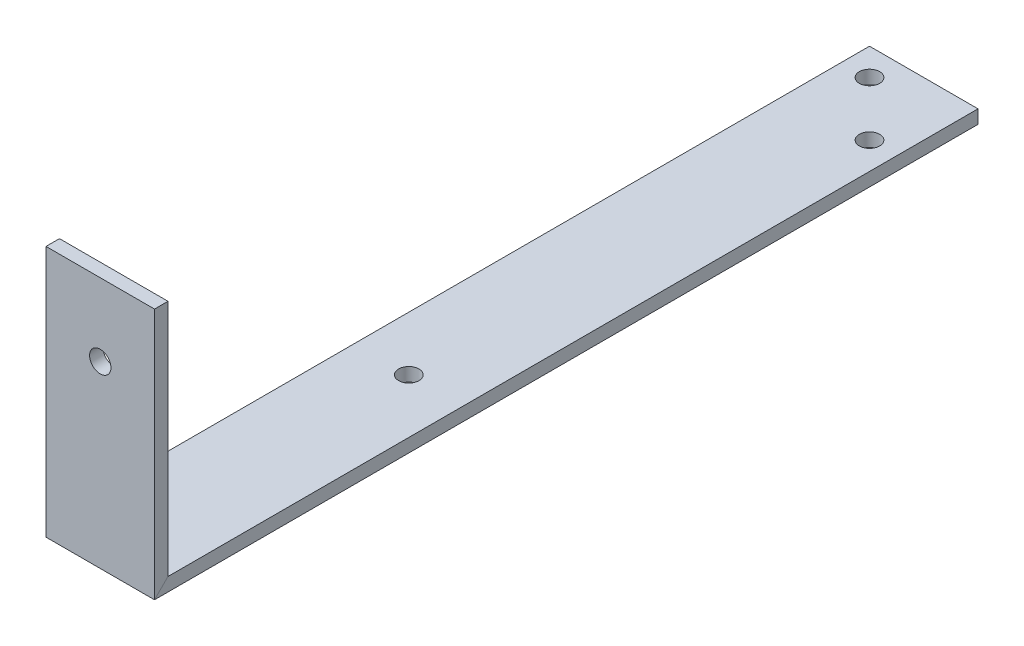
ISO-10303-21;
HEADER;
FILE_DESCRIPTION(('STEP AP214'),'2;1');
FILE_NAME('part.step','',(''),(''),'','','');
FILE_SCHEMA(('AUTOMOTIVE_DESIGN { 1 0 10303 214 1 1 1 1 }'));
ENDSEC;
DATA;
#1=APPLICATION_CONTEXT('core data for automotive mechanical design processes');
#2=APPLICATION_PROTOCOL_DEFINITION('international standard','automotive_design',2000,#1);
#3=PRODUCT_CONTEXT('',#1,'mechanical');
#4=PRODUCT('Part','Part','',(#3));
#5=PRODUCT_RELATED_PRODUCT_CATEGORY('part','',(#4));
#6=PRODUCT_DEFINITION_FORMATION('','',#4);
#7=PRODUCT_DEFINITION_CONTEXT('part definition',#1,'design');
#8=PRODUCT_DEFINITION('design','',#6,#7);
#9=PRODUCT_DEFINITION_SHAPE('','',#8);
#10=(LENGTH_UNIT() NAMED_UNIT(*) SI_UNIT(.MILLI.,.METRE.));
#11=(NAMED_UNIT(*) PLANE_ANGLE_UNIT() SI_UNIT($,.RADIAN.));
#12=(NAMED_UNIT(*) SI_UNIT($,.STERADIAN.) SOLID_ANGLE_UNIT());
#13=UNCERTAINTY_MEASURE_WITH_UNIT(LENGTH_MEASURE(1.E-05),#10,'distance_accuracy_value','');
#14=(GEOMETRIC_REPRESENTATION_CONTEXT(3) GLOBAL_UNCERTAINTY_ASSIGNED_CONTEXT((#13)) GLOBAL_UNIT_ASSIGNED_CONTEXT((#10,
#11,#12)) REPRESENTATION_CONTEXT('',''));
#15=CARTESIAN_POINT('',(0.,0.,0.));
#16=DIRECTION('',(0.,0.,1.));
#17=DIRECTION('',(1.,0.,0.));
#18=AXIS2_PLACEMENT_3D('',#15,#16,#17);
#19=CARTESIAN_POINT('',(1761.3,-570.395,308.16));
#20=DIRECTION('',(0.,1.,0.));
#21=DIRECTION('',(0.,0.,1.));
#22=AXIS2_PLACEMENT_3D('',#19,#20,#21);
#23=PLANE('',#22);
#24=CARTESIAN_POINT('',(1773.99999999906,-570.395,323.462204665884));
#25=DIRECTION('',(0.,-1.,0.));
#26=DIRECTION('',(0.,0.,-1.));
#27=AXIS2_PLACEMENT_3D('',#24,#25,#26);
#28=CIRCLE('',#27,4.76250000000013);
#29=CARTESIAN_POINT('',(1773.99999999906,-570.395,318.699704665884));
#30=VERTEX_POINT('',#29);
#31=EDGE_CURVE('E145',#30,#30,#28,.T.);
#32=ORIENTED_EDGE('',*,*,#31,.F.);
#33=EDGE_LOOP('',(#32));
#34=FACE_BOUND('',#33,.T.);
#35=CARTESIAN_POINT('',(1799.39999999906,-570.395,348.862204665884));
#36=DIRECTION('',(0.,-1.,0.));
#37=DIRECTION('',(0.,0.,-1.));
#38=AXIS2_PLACEMENT_3D('',#35,#36,#37);
#39=CIRCLE('',#38,4.76250000000011);
#40=CARTESIAN_POINT('',(1799.39999999906,-570.395,344.099704665884));
#41=VERTEX_POINT('',#40);
#42=EDGE_CURVE('E134',#41,#41,#39,.T.);
#43=ORIENTED_EDGE('',*,*,#42,.F.);
#44=EDGE_LOOP('',(#43));
#45=FACE_BOUND('',#44,.T.);
#46=CARTESIAN_POINT('',(1786.7,-570.395,551.855));
#47=DIRECTION('',(0.,1.,0.));
#48=DIRECTION('',(0.,0.,1.));
#49=AXIS2_PLACEMENT_3D('',#46,#47,#48);
#50=CIRCLE('',#49,4.76249999999992);
#51=CARTESIAN_POINT('',(1786.7,-570.395,556.6175));
#52=VERTEX_POINT('',#51);
#53=EDGE_CURVE('E95',#52,#52,#50,.T.);
#54=ORIENTED_EDGE('',*,*,#53,.T.);
#55=EDGE_LOOP('',(#54));
#56=FACE_BOUND('',#55,.T.);
#57=DIRECTION('',(-1.,0.,0.));
#58=VECTOR('',#57,1.);
#59=CARTESIAN_POINT('',(1812.1,-570.395,310.76));
#60=LINE('',#59,#58);
#61=CARTESIAN_POINT('',(1812.1,-570.395,310.76));
#62=VERTEX_POINT('',#61);
#63=CARTESIAN_POINT('',(1761.3,-570.395,310.76));
#64=VERTEX_POINT('',#63);
#65=EDGE_CURVE('E51',#62,#64,#60,.T.);
#66=ORIENTED_EDGE('',*,*,#65,.F.);
#67=DIRECTION('',(0.,0.,1.));
#68=VECTOR('',#67,1.);
#69=CARTESIAN_POINT('',(1812.1,-570.395,308.16));
#70=LINE('',#69,#68);
#71=CARTESIAN_POINT('',(1812.1,-570.395,696.315));
#72=VERTEX_POINT('',#71);
#73=EDGE_CURVE('E103',#62,#72,#70,.T.);
#74=ORIENTED_EDGE('',*,*,#73,.T.);
#75=DIRECTION('',(1.,0.,0.));
#76=VECTOR('',#75,1.);
#77=CARTESIAN_POINT('',(1761.3,-570.395,696.315));
#78=LINE('',#77,#76);
#79=CARTESIAN_POINT('',(1761.3,-570.395,696.315));
#80=VERTEX_POINT('',#79);
#81=EDGE_CURVE('E119',#80,#72,#78,.T.);
#82=ORIENTED_EDGE('',*,*,#81,.F.);
#83=DIRECTION('',(0.,0.,1.));
#84=VECTOR('',#83,1.);
#85=CARTESIAN_POINT('',(1761.3,-570.395,308.16));
#86=LINE('',#85,#84);
#87=EDGE_CURVE('E109',#64,#80,#86,.T.);
#88=ORIENTED_EDGE('',*,*,#87,.F.);
#89=EDGE_LOOP('',(#66,#74,#82,#88));
#90=FACE_BOUND('',#89,.T.);
#91=ADVANCED_FACE('F34',(#34,#45,#56,#90),#23,.F.);
#92=CARTESIAN_POINT('',(1812.1,-570.395,308.16));
#93=DIRECTION('',(-1.,0.,0.));
#94=DIRECTION('',(0.,0.,1.));
#95=AXIS2_PLACEMENT_3D('',#92,#93,#94);
#96=PLANE('',#95);
#97=DIRECTION('',(0.,-1.,0.));
#98=VECTOR('',#97,1.);
#99=CARTESIAN_POINT('',(1812.1,-564.085,310.76));
#100=LINE('',#99,#98);
#101=CARTESIAN_POINT('',(1812.1,-564.085,310.76));
#102=VERTEX_POINT('',#101);
#103=EDGE_CURVE('E90',#102,#62,#100,.T.);
#104=ORIENTED_EDGE('',*,*,#103,.F.);
#105=DIRECTION('',(0.,0.,1.));
#106=VECTOR('',#105,1.);
#107=CARTESIAN_POINT('',(1812.1,-564.085,308.16));
#108=LINE('',#107,#106);
#109=CARTESIAN_POINT('',(1812.1,-564.085,690.005));
#110=VERTEX_POINT('',#109);
#111=EDGE_CURVE('E101',#102,#110,#108,.T.);
#112=ORIENTED_EDGE('',*,*,#111,.T.);
#113=DIRECTION('',(0.,0.707106781186548,-0.707106781186548));
#114=VECTOR('',#113,1.);
#115=CARTESIAN_POINT('',(1812.1,-376.3175,502.2375));
#116=LINE('',#115,#114);
#117=EDGE_CURVE('E43',#72,#110,#116,.T.);
#118=ORIENTED_EDGE('',*,*,#117,.F.);
#119=ORIENTED_EDGE('',*,*,#73,.F.);
#120=EDGE_LOOP('',(#104,#112,#118,#119));
#121=FACE_BOUND('',#120,.T.);
#122=ADVANCED_FACE('F99',(#121),#96,.F.);
#123=CARTESIAN_POINT('',(1761.3,-564.085,308.16));
#124=DIRECTION('',(0.,-1.,0.));
#125=DIRECTION('',(0.,0.,-1.));
#126=AXIS2_PLACEMENT_3D('',#123,#124,#125);
#127=PLANE('',#126);
#128=CARTESIAN_POINT('',(1773.99999999906,-564.085,323.462204665884));
#129=DIRECTION('',(0.,-1.,0.));
#130=DIRECTION('',(0.,0.,-1.));
#131=AXIS2_PLACEMENT_3D('',#128,#129,#130);
#132=CIRCLE('',#131,4.76250000000013);
#133=CARTESIAN_POINT('',(1773.99999999906,-564.085,318.699704665884));
#134=VERTEX_POINT('',#133);
#135=EDGE_CURVE('E38',#134,#134,#132,.T.);
#136=ORIENTED_EDGE('',*,*,#135,.T.);
#137=EDGE_LOOP('',(#136));
#138=FACE_BOUND('',#137,.T.);
#139=CARTESIAN_POINT('',(1799.39999999906,-564.085,348.862204665884));
#140=DIRECTION('',(0.,-1.,0.));
#141=DIRECTION('',(0.,0.,-1.));
#142=AXIS2_PLACEMENT_3D('',#139,#140,#141);
#143=CIRCLE('',#142,4.76250000000011);
#144=CARTESIAN_POINT('',(1799.39999999906,-564.085,344.099704665884));
#145=VERTEX_POINT('',#144);
#146=EDGE_CURVE('E131',#145,#145,#143,.T.);
#147=ORIENTED_EDGE('',*,*,#146,.T.);
#148=EDGE_LOOP('',(#147));
#149=FACE_BOUND('',#148,.T.);
#150=CARTESIAN_POINT('',(1786.7,-564.085,551.855));
#151=DIRECTION('',(0.,1.,0.));
#152=DIRECTION('',(0.,0.,1.));
#153=AXIS2_PLACEMENT_3D('',#150,#151,#152);
#154=CIRCLE('',#153,4.76249999999992);
#155=CARTESIAN_POINT('',(1786.7,-564.085,556.6175));
#156=VERTEX_POINT('',#155);
#157=EDGE_CURVE('E150',#156,#156,#154,.T.);
#158=ORIENTED_EDGE('',*,*,#157,.F.);
#159=EDGE_LOOP('',(#158));
#160=FACE_BOUND('',#159,.T.);
#161=DIRECTION('',(1.,0.,0.));
#162=VECTOR('',#161,1.);
#163=CARTESIAN_POINT('',(1761.3,-564.085,310.76));
#164=LINE('',#163,#162);
#165=CARTESIAN_POINT('',(1761.3,-564.085,310.76));
#166=VERTEX_POINT('',#165);
#167=EDGE_CURVE('E87',#166,#102,#164,.T.);
#168=ORIENTED_EDGE('',*,*,#167,.F.);
#169=DIRECTION('',(0.,0.,1.));
#170=VECTOR('',#169,1.);
#171=CARTESIAN_POINT('',(1761.3,-564.085,308.16));
#172=LINE('',#171,#170);
#173=CARTESIAN_POINT('',(1761.3,-564.085,690.005));
#174=VERTEX_POINT('',#173);
#175=EDGE_CURVE('E107',#166,#174,#172,.T.);
#176=ORIENTED_EDGE('',*,*,#175,.T.);
#177=DIRECTION('',(-1.,0.,0.));
#178=VECTOR('',#177,1.);
#179=CARTESIAN_POINT('',(1761.3,-564.085,690.005));
#180=LINE('',#179,#178);
#181=EDGE_CURVE('E11',#110,#174,#180,.T.);
#182=ORIENTED_EDGE('',*,*,#181,.F.);
#183=ORIENTED_EDGE('',*,*,#111,.F.);
#184=EDGE_LOOP('',(#168,#176,#182,#183));
#185=FACE_BOUND('',#184,.T.);
#186=ADVANCED_FACE('F105',(#138,#149,#160,#185),#127,.F.);
#187=CARTESIAN_POINT('',(1761.3,-570.395,308.16));
#188=DIRECTION('',(1.,0.,0.));
#189=DIRECTION('',(0.,0.,-1.));
#190=AXIS2_PLACEMENT_3D('',#187,#188,#189);
#191=PLANE('',#190);
#192=DIRECTION('',(0.,1.,0.));
#193=VECTOR('',#192,1.);
#194=CARTESIAN_POINT('',(1761.3,-570.395,310.76));
#195=LINE('',#194,#193);
#196=EDGE_CURVE('E91',#64,#166,#195,.T.);
#197=ORIENTED_EDGE('',*,*,#196,.F.);
#198=ORIENTED_EDGE('',*,*,#87,.T.);
#199=DIRECTION('',(0.,-0.707106781186548,0.707106781186548));
#200=VECTOR('',#199,1.);
#201=CARTESIAN_POINT('',(1761.3,-376.3175,502.2375));
#202=LINE('',#201,#200);
#203=EDGE_CURVE('E116',#174,#80,#202,.T.);
#204=ORIENTED_EDGE('',*,*,#203,.F.);
#205=ORIENTED_EDGE('',*,*,#175,.F.);
#206=EDGE_LOOP('',(#197,#198,#204,#205));
#207=FACE_BOUND('',#206,.T.);
#208=ADVANCED_FACE('F183',(#207),#191,.F.);
#209=CARTESIAN_POINT('',(1761.3,-570.8105,696.315));
#210=DIRECTION('',(0.,0.,-1.));
#211=DIRECTION('',(-1.,0.,0.));
#212=AXIS2_PLACEMENT_3D('',#209,#210,#211);
#213=PLANE('',#212);
#214=CARTESIAN_POINT('',(1786.70000007806,-486.498712740003,696.315));
#215=DIRECTION('',(0.,0.,-1.));
#216=DIRECTION('',(-1.,0.,0.));
#217=AXIS2_PLACEMENT_3D('',#214,#215,#216);
#218=CIRCLE('',#217,5.00000002243565);
#219=CARTESIAN_POINT('',(1781.70000005563,-486.498712740003,696.315));
#220=VERTEX_POINT('',#219);
#221=EDGE_CURVE('E138',#220,#220,#218,.T.);
#222=ORIENTED_EDGE('',*,*,#221,.T.);
#223=EDGE_LOOP('',(#222));
#224=FACE_BOUND('',#223,.T.);
#225=DIRECTION('',(0.,1.,0.));
#226=VECTOR('',#225,1.);
#227=CARTESIAN_POINT('',(1812.1,-570.8105,696.315));
#228=LINE('',#227,#226);
#229=CARTESIAN_POINT('',(1812.1,-452.495,696.315));
#230=VERTEX_POINT('',#229);
#231=EDGE_CURVE('E120',#72,#230,#228,.T.);
#232=ORIENTED_EDGE('',*,*,#231,.T.);
#233=DIRECTION('',(1.,0.,0.));
#234=VECTOR('',#233,1.);
#235=CARTESIAN_POINT('',(2022.1,-452.495,696.315));
#236=LINE('',#235,#234);
#237=CARTESIAN_POINT('',(1761.3,-452.495,696.315));
#238=VERTEX_POINT('',#237);
#239=EDGE_CURVE('E157',#238,#230,#236,.T.);
#240=ORIENTED_EDGE('',*,*,#239,.F.);
#241=DIRECTION('',(0.,1.,0.));
#242=VECTOR('',#241,1.);
#243=CARTESIAN_POINT('',(1761.3,-570.8105,696.315));
#244=LINE('',#243,#242);
#245=EDGE_CURVE('E111',#80,#238,#244,.T.);
#246=ORIENTED_EDGE('',*,*,#245,.F.);
#247=ORIENTED_EDGE('',*,*,#81,.T.);
#248=EDGE_LOOP('',(#232,#240,#246,#247));
#249=FACE_BOUND('',#248,.T.);
#250=ADVANCED_FACE('F36',(#224,#249),#213,.F.);
#251=CARTESIAN_POINT('',(1812.1,-570.8105,696.315));
#252=DIRECTION('',(-1.,0.,0.));
#253=DIRECTION('',(0.,0.,1.));
#254=AXIS2_PLACEMENT_3D('',#251,#252,#253);
#255=PLANE('',#254);
#256=DIRECTION('',(0.,1.,0.));
#257=VECTOR('',#256,1.);
#258=CARTESIAN_POINT('',(1812.1,-570.8105,690.005));
#259=LINE('',#258,#257);
#260=CARTESIAN_POINT('',(1812.1,-452.495,690.005));
#261=VERTEX_POINT('',#260);
#262=EDGE_CURVE('E123',#110,#261,#259,.T.);
#263=ORIENTED_EDGE('',*,*,#262,.T.);
#264=DIRECTION('',(0.,0.,1.));
#265=VECTOR('',#264,1.);
#266=CARTESIAN_POINT('',(1812.1,-452.495,696.315));
#267=LINE('',#266,#265);
#268=EDGE_CURVE('E124',#261,#230,#267,.T.);
#269=ORIENTED_EDGE('',*,*,#268,.T.);
#270=ORIENTED_EDGE('',*,*,#231,.F.);
#271=ORIENTED_EDGE('',*,*,#117,.T.);
#272=EDGE_LOOP('',(#263,#269,#270,#271));
#273=FACE_BOUND('',#272,.T.);
#274=ADVANCED_FACE('F174',(#273),#255,.F.);
#275=CARTESIAN_POINT('',(1761.3,-570.8105,690.005));
#276=DIRECTION('',(0.,0.,1.));
#277=DIRECTION('',(1.,0.,0.));
#278=AXIS2_PLACEMENT_3D('',#275,#276,#277);
#279=PLANE('',#278);
#280=CARTESIAN_POINT('',(1786.70000007806,-486.498712740003,690.005));
#281=DIRECTION('',(0.,0.,-1.));
#282=DIRECTION('',(-1.,0.,0.));
#283=AXIS2_PLACEMENT_3D('',#280,#281,#282);
#284=CIRCLE('',#283,5.00000002243565);
#285=CARTESIAN_POINT('',(1781.70000005563,-486.498712740003,690.005));
#286=VERTEX_POINT('',#285);
#287=EDGE_CURVE('E133',#286,#286,#284,.T.);
#288=ORIENTED_EDGE('',*,*,#287,.F.);
#289=EDGE_LOOP('',(#288));
#290=FACE_BOUND('',#289,.T.);
#291=DIRECTION('',(0.,1.,0.));
#292=VECTOR('',#291,1.);
#293=CARTESIAN_POINT('',(1761.3,-570.8105,690.005));
#294=LINE('',#293,#292);
#295=CARTESIAN_POINT('',(1761.3,-452.495,690.005));
#296=VERTEX_POINT('',#295);
#297=EDGE_CURVE('E127',#174,#296,#294,.T.);
#298=ORIENTED_EDGE('',*,*,#297,.T.);
#299=DIRECTION('',(-1.,0.,0.));
#300=VECTOR('',#299,1.);
#301=CARTESIAN_POINT('',(1761.3,-452.495,690.005));
#302=LINE('',#301,#300);
#303=EDGE_CURVE('E59',#261,#296,#302,.T.);
#304=ORIENTED_EDGE('',*,*,#303,.F.);
#305=ORIENTED_EDGE('',*,*,#262,.F.);
#306=ORIENTED_EDGE('',*,*,#181,.T.);
#307=EDGE_LOOP('',(#298,#304,#305,#306));
#308=FACE_BOUND('',#307,.T.);
#309=ADVANCED_FACE('F177',(#290,#308),#279,.F.);
#310=CARTESIAN_POINT('',(1761.3,-570.8105,696.315));
#311=DIRECTION('',(1.,0.,0.));
#312=DIRECTION('',(0.,0.,-1.));
#313=AXIS2_PLACEMENT_3D('',#310,#311,#312);
#314=PLANE('',#313);
#315=ORIENTED_EDGE('',*,*,#245,.T.);
#316=DIRECTION('',(0.,0.,1.));
#317=VECTOR('',#316,1.);
#318=CARTESIAN_POINT('',(1761.3,-452.495,696.315));
#319=LINE('',#318,#317);
#320=EDGE_CURVE('E160',#296,#238,#319,.T.);
#321=ORIENTED_EDGE('',*,*,#320,.F.);
#322=ORIENTED_EDGE('',*,*,#297,.F.);
#323=ORIENTED_EDGE('',*,*,#203,.T.);
#324=EDGE_LOOP('',(#315,#321,#322,#323));
#325=FACE_BOUND('',#324,.T.);
#326=ADVANCED_FACE('F180',(#325),#314,.F.);
#327=CARTESIAN_POINT('',(0.,-452.495,0.));
#328=DIRECTION('',(0.,-1.,0.));
#329=DIRECTION('',(0.,0.,-1.));
#330=AXIS2_PLACEMENT_3D('',#327,#328,#329);
#331=PLANE('',#330);
#332=ORIENTED_EDGE('',*,*,#303,.T.);
#333=ORIENTED_EDGE('',*,*,#320,.T.);
#334=ORIENTED_EDGE('',*,*,#239,.T.);
#335=ORIENTED_EDGE('',*,*,#268,.F.);
#336=EDGE_LOOP('',(#332,#333,#334,#335));
#337=FACE_BOUND('',#336,.T.);
#338=ADVANCED_FACE('F175',(#337),#331,.F.);
#339=CARTESIAN_POINT('',(0.,0.,310.76));
#340=DIRECTION('',(0.,0.,-1.));
#341=DIRECTION('',(-1.,0.,0.));
#342=AXIS2_PLACEMENT_3D('',#339,#340,#341);
#343=PLANE('',#342);
#344=ORIENTED_EDGE('',*,*,#167,.T.);
#345=ORIENTED_EDGE('',*,*,#103,.T.);
#346=ORIENTED_EDGE('',*,*,#65,.T.);
#347=ORIENTED_EDGE('',*,*,#196,.T.);
#348=EDGE_LOOP('',(#344,#345,#346,#347));
#349=FACE_BOUND('',#348,.T.);
#350=ADVANCED_FACE('F89',(#349),#343,.T.);
#351=CARTESIAN_POINT('',(1786.7,-597.085,551.855));
#352=DIRECTION('',(0.,1.,0.));
#353=DIRECTION('',(0.,0.,1.));
#354=AXIS2_PLACEMENT_3D('',#351,#352,#353);
#355=CYLINDRICAL_SURFACE('',#354,4.76249999999992);
#356=ORIENTED_EDGE('',*,*,#157,.T.);
#357=EDGE_LOOP('',(#356));
#358=FACE_BOUND('',#357,.T.);
#359=ORIENTED_EDGE('',*,*,#53,.F.);
#360=EDGE_LOOP('',(#359));
#361=FACE_BOUND('',#360,.T.);
#362=ADVANCED_FACE('F234',(#358,#361),#355,.F.);
#363=CARTESIAN_POINT('',(1786.70000007806,-486.498712740003,723.005));
#364=DIRECTION('',(0.,0.,-1.));
#365=DIRECTION('',(-1.,0.,0.));
#366=AXIS2_PLACEMENT_3D('',#363,#364,#365);
#367=CYLINDRICAL_SURFACE('',#366,5.00000002243565);
#368=ORIENTED_EDGE('',*,*,#287,.T.);
#369=EDGE_LOOP('',(#368));
#370=FACE_BOUND('',#369,.T.);
#371=ORIENTED_EDGE('',*,*,#221,.F.);
#372=EDGE_LOOP('',(#371));
#373=FACE_BOUND('',#372,.T.);
#374=ADVANCED_FACE('F241',(#370,#373),#367,.F.);
#375=CARTESIAN_POINT('',(1799.39999999906,-520.395,348.862204665884));
#376=DIRECTION('',(0.,-1.,0.));
#377=DIRECTION('',(0.,0.,-1.));
#378=AXIS2_PLACEMENT_3D('',#375,#376,#377);
#379=CYLINDRICAL_SURFACE('',#378,4.76250000000011);
#380=ORIENTED_EDGE('',*,*,#42,.T.);
#381=EDGE_LOOP('',(#380));
#382=FACE_BOUND('',#381,.T.);
#383=ORIENTED_EDGE('',*,*,#146,.F.);
#384=EDGE_LOOP('',(#383));
#385=FACE_BOUND('',#384,.T.);
#386=ADVANCED_FACE('F249',(#382,#385),#379,.F.);
#387=CARTESIAN_POINT('',(1773.99999999906,-520.395,323.462204665884));
#388=DIRECTION('',(0.,-1.,0.));
#389=DIRECTION('',(0.,0.,-1.));
#390=AXIS2_PLACEMENT_3D('',#387,#388,#389);
#391=CYLINDRICAL_SURFACE('',#390,4.76250000000013);
#392=ORIENTED_EDGE('',*,*,#31,.T.);
#393=EDGE_LOOP('',(#392));
#394=FACE_BOUND('',#393,.T.);
#395=ORIENTED_EDGE('',*,*,#135,.F.);
#396=EDGE_LOOP('',(#395));
#397=FACE_BOUND('',#396,.T.);
#398=ADVANCED_FACE('F257',(#394,#397),#391,.F.);
#399=CLOSED_SHELL('',(#91,#122,#186,#208,#250,#274,#309,#326,#338,#350,#362,#374,#386,#398));
#400=MANIFOLD_SOLID_BREP('B2',#399);
#401=ADVANCED_BREP_SHAPE_REPRESENTATION('',(#18,#400),#14);
#402=SHAPE_DEFINITION_REPRESENTATION(#9,#401);
ENDSEC;
END-ISO-10303-21;
